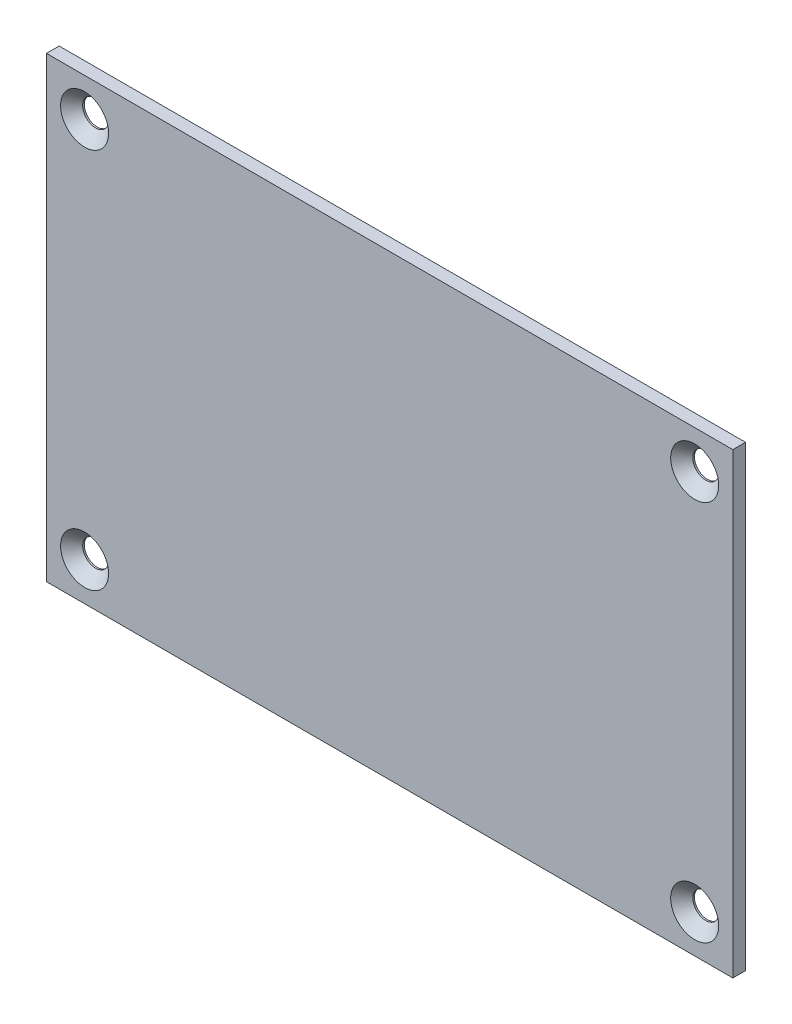
ISO-10303-21;
HEADER;
FILE_DESCRIPTION(('STEP AP214'),'2;1');
FILE_NAME('part.step','',(''),(''),'','','');
FILE_SCHEMA(('AUTOMOTIVE_DESIGN { 1 0 10303 214 1 1 1 1 }'));
ENDSEC;
DATA;
#1=APPLICATION_CONTEXT('core data for automotive mechanical design processes');
#2=APPLICATION_PROTOCOL_DEFINITION('international standard','automotive_design',2000,#1);
#3=PRODUCT_CONTEXT('',#1,'mechanical');
#4=PRODUCT('Part','Part','',(#3));
#5=PRODUCT_RELATED_PRODUCT_CATEGORY('part','',(#4));
#6=PRODUCT_DEFINITION_FORMATION('','',#4);
#7=PRODUCT_DEFINITION_CONTEXT('part definition',#1,'design');
#8=PRODUCT_DEFINITION('design','',#6,#7);
#9=PRODUCT_DEFINITION_SHAPE('','',#8);
#10=(LENGTH_UNIT() NAMED_UNIT(*) SI_UNIT(.MILLI.,.METRE.));
#11=(NAMED_UNIT(*) PLANE_ANGLE_UNIT() SI_UNIT($,.RADIAN.));
#12=(NAMED_UNIT(*) SI_UNIT($,.STERADIAN.) SOLID_ANGLE_UNIT());
#13=UNCERTAINTY_MEASURE_WITH_UNIT(LENGTH_MEASURE(1.E-05),#10,'distance_accuracy_value','');
#14=(GEOMETRIC_REPRESENTATION_CONTEXT(3) GLOBAL_UNCERTAINTY_ASSIGNED_CONTEXT((#13)) GLOBAL_UNIT_ASSIGNED_CONTEXT((#10,
#11,#12)) REPRESENTATION_CONTEXT('',''));
#15=CARTESIAN_POINT('',(0.,0.,0.));
#16=DIRECTION('',(0.,0.,1.));
#17=DIRECTION('',(1.,0.,0.));
#18=AXIS2_PLACEMENT_3D('',#15,#16,#17);
#19=CARTESIAN_POINT('',(0.,0.,1.666));
#20=DIRECTION('',(1.,0.,0.));
#21=DIRECTION('',(0.,0.,-1.));
#22=AXIS2_PLACEMENT_3D('',#19,#20,#21);
#23=PLANE('',#22);
#24=DIRECTION('',(0.,-1.,0.));
#25=VECTOR('',#24,1.);
#26=CARTESIAN_POINT('',(0.,0.,0.));
#27=LINE('',#26,#25);
#28=CARTESIAN_POINT('',(0.,60.,0.));
#29=VERTEX_POINT('',#28);
#30=CARTESIAN_POINT('',(0.,0.,0.));
#31=VERTEX_POINT('',#30);
#32=EDGE_CURVE('E116',#29,#31,#27,.T.);
#33=ORIENTED_EDGE('',*,*,#32,.T.);
#34=DIRECTION('',(0.,0.,-1.));
#35=VECTOR('',#34,1.);
#36=CARTESIAN_POINT('',(0.,0.,1.666));
#37=LINE('',#36,#35);
#38=CARTESIAN_POINT('',(0.,0.,1.666));
#39=VERTEX_POINT('',#38);
#40=EDGE_CURVE('E11',#39,#31,#37,.T.);
#41=ORIENTED_EDGE('',*,*,#40,.F.);
#42=DIRECTION('',(0.,-1.,0.));
#43=VECTOR('',#42,1.);
#44=CARTESIAN_POINT('',(0.,0.,1.666));
#45=LINE('',#44,#43);
#46=CARTESIAN_POINT('',(0.,60.,1.666));
#47=VERTEX_POINT('',#46);
#48=EDGE_CURVE('E99',#47,#39,#45,.T.);
#49=ORIENTED_EDGE('',*,*,#48,.F.);
#50=DIRECTION('',(0.,0.,-1.));
#51=VECTOR('',#50,1.);
#52=CARTESIAN_POINT('',(0.,60.,1.666));
#53=LINE('',#52,#51);
#54=EDGE_CURVE('E112',#47,#29,#53,.T.);
#55=ORIENTED_EDGE('',*,*,#54,.T.);
#56=EDGE_LOOP('',(#33,#41,#49,#55));
#57=FACE_BOUND('',#56,.T.);
#58=ADVANCED_FACE('F45',(#57),#23,.F.);
#59=CARTESIAN_POINT('',(0.,0.,1.666));
#60=DIRECTION('',(0.,1.,0.));
#61=DIRECTION('',(0.,0.,1.));
#62=AXIS2_PLACEMENT_3D('',#59,#60,#61);
#63=PLANE('',#62);
#64=DIRECTION('',(1.,0.,0.));
#65=VECTOR('',#64,1.);
#66=CARTESIAN_POINT('',(0.,0.,0.));
#67=LINE('',#66,#65);
#68=CARTESIAN_POINT('',(90.,0.,0.));
#69=VERTEX_POINT('',#68);
#70=EDGE_CURVE('E104',#31,#69,#67,.T.);
#71=ORIENTED_EDGE('',*,*,#70,.T.);
#72=DIRECTION('',(0.,0.,-1.));
#73=VECTOR('',#72,1.);
#74=CARTESIAN_POINT('',(90.,0.,1.666));
#75=LINE('',#74,#73);
#76=CARTESIAN_POINT('',(90.,0.,1.666));
#77=VERTEX_POINT('',#76);
#78=EDGE_CURVE('E55',#77,#69,#75,.T.);
#79=ORIENTED_EDGE('',*,*,#78,.F.);
#80=DIRECTION('',(1.,0.,0.));
#81=VECTOR('',#80,1.);
#82=CARTESIAN_POINT('',(0.,0.,1.666));
#83=LINE('',#82,#81);
#84=EDGE_CURVE('E94',#39,#77,#83,.T.);
#85=ORIENTED_EDGE('',*,*,#84,.F.);
#86=ORIENTED_EDGE('',*,*,#40,.T.);
#87=EDGE_LOOP('',(#71,#79,#85,#86));
#88=FACE_BOUND('',#87,.T.);
#89=ADVANCED_FACE('F103',(#88),#63,.F.);
#90=CARTESIAN_POINT('',(90.,0.,1.666));
#91=DIRECTION('',(-1.,0.,0.));
#92=DIRECTION('',(0.,0.,1.));
#93=AXIS2_PLACEMENT_3D('',#90,#91,#92);
#94=PLANE('',#93);
#95=DIRECTION('',(0.,1.,0.));
#96=VECTOR('',#95,1.);
#97=CARTESIAN_POINT('',(90.,0.,0.));
#98=LINE('',#97,#96);
#99=CARTESIAN_POINT('',(90.,60.,0.));
#100=VERTEX_POINT('',#99);
#101=EDGE_CURVE('E81',#69,#100,#98,.T.);
#102=ORIENTED_EDGE('',*,*,#101,.T.);
#103=DIRECTION('',(0.,0.,-1.));
#104=VECTOR('',#103,1.);
#105=CARTESIAN_POINT('',(90.,60.,1.666));
#106=LINE('',#105,#104);
#107=CARTESIAN_POINT('',(90.,60.,1.666));
#108=VERTEX_POINT('',#107);
#109=EDGE_CURVE('E106',#108,#100,#106,.T.);
#110=ORIENTED_EDGE('',*,*,#109,.F.);
#111=DIRECTION('',(0.,1.,0.));
#112=VECTOR('',#111,1.);
#113=CARTESIAN_POINT('',(90.,0.,1.666));
#114=LINE('',#113,#112);
#115=EDGE_CURVE('E97',#77,#108,#114,.T.);
#116=ORIENTED_EDGE('',*,*,#115,.F.);
#117=ORIENTED_EDGE('',*,*,#78,.T.);
#118=EDGE_LOOP('',(#102,#110,#116,#117));
#119=FACE_BOUND('',#118,.T.);
#120=ADVANCED_FACE('F108',(#119),#94,.F.);
#121=CARTESIAN_POINT('',(0.,60.,1.666));
#122=DIRECTION('',(0.,-1.,0.));
#123=DIRECTION('',(0.,0.,-1.));
#124=AXIS2_PLACEMENT_3D('',#121,#122,#123);
#125=PLANE('',#124);
#126=DIRECTION('',(-1.,0.,0.));
#127=VECTOR('',#126,1.);
#128=CARTESIAN_POINT('',(0.,60.,0.));
#129=LINE('',#128,#127);
#130=EDGE_CURVE('E87',#100,#29,#129,.T.);
#131=ORIENTED_EDGE('',*,*,#130,.T.);
#132=ORIENTED_EDGE('',*,*,#54,.F.);
#133=DIRECTION('',(-1.,0.,0.));
#134=VECTOR('',#133,1.);
#135=CARTESIAN_POINT('',(0.,60.,1.666));
#136=LINE('',#135,#134);
#137=EDGE_CURVE('E64',#108,#47,#136,.T.);
#138=ORIENTED_EDGE('',*,*,#137,.F.);
#139=ORIENTED_EDGE('',*,*,#109,.T.);
#140=EDGE_LOOP('',(#131,#132,#138,#139));
#141=FACE_BOUND('',#140,.T.);
#142=ADVANCED_FACE('F183',(#141),#125,.F.);
#143=CARTESIAN_POINT('',(0.,0.,1.666));
#144=DIRECTION('',(0.,0.,-1.));
#145=DIRECTION('',(-1.,0.,0.));
#146=AXIS2_PLACEMENT_3D('',#143,#144,#145);
#147=PLANE('',#146);
#148=CARTESIAN_POINT('',(5.,55.,1.666));
#149=DIRECTION('',(0.,0.,1.));
#150=DIRECTION('',(1.,0.,0.));
#151=AXIS2_PLACEMENT_3D('',#148,#149,#150);
#152=CIRCLE('',#151,3.15);
#153=CARTESIAN_POINT('',(8.15,55.,1.666));
#154=VERTEX_POINT('',#153);
#155=EDGE_CURVE('E305',#154,#154,#152,.T.);
#156=ORIENTED_EDGE('',*,*,#155,.F.);
#157=EDGE_LOOP('',(#156));
#158=FACE_BOUND('',#157,.T.);
#159=CARTESIAN_POINT('',(5.,5.,1.666));
#160=DIRECTION('',(0.,0.,1.));
#161=DIRECTION('',(1.,0.,0.));
#162=AXIS2_PLACEMENT_3D('',#159,#160,#161);
#163=CIRCLE('',#162,3.15);
#164=CARTESIAN_POINT('',(8.15,5.,1.666));
#165=VERTEX_POINT('',#164);
#166=EDGE_CURVE('E152',#165,#165,#163,.T.);
#167=ORIENTED_EDGE('',*,*,#166,.F.);
#168=EDGE_LOOP('',(#167));
#169=FACE_BOUND('',#168,.T.);
#170=CARTESIAN_POINT('',(85.,5.,1.666));
#171=DIRECTION('',(0.,0.,1.));
#172=DIRECTION('',(1.,0.,0.));
#173=AXIS2_PLACEMENT_3D('',#170,#171,#172);
#174=CIRCLE('',#173,3.15);
#175=CARTESIAN_POINT('',(88.15,5.,1.666));
#176=VERTEX_POINT('',#175);
#177=EDGE_CURVE('E143',#176,#176,#174,.T.);
#178=ORIENTED_EDGE('',*,*,#177,.F.);
#179=EDGE_LOOP('',(#178));
#180=FACE_BOUND('',#179,.T.);
#181=CARTESIAN_POINT('',(85.,55.,1.666));
#182=DIRECTION('',(0.,0.,1.));
#183=DIRECTION('',(1.,0.,0.));
#184=AXIS2_PLACEMENT_3D('',#181,#182,#183);
#185=CIRCLE('',#184,3.15);
#186=CARTESIAN_POINT('',(88.15,55.,1.666));
#187=VERTEX_POINT('',#186);
#188=EDGE_CURVE('E138',#187,#187,#185,.T.);
#189=ORIENTED_EDGE('',*,*,#188,.F.);
#190=EDGE_LOOP('',(#189));
#191=FACE_BOUND('',#190,.T.);
#192=ORIENTED_EDGE('',*,*,#48,.T.);
#193=ORIENTED_EDGE('',*,*,#84,.T.);
#194=ORIENTED_EDGE('',*,*,#115,.T.);
#195=ORIENTED_EDGE('',*,*,#137,.T.);
#196=EDGE_LOOP('',(#192,#193,#194,#195));
#197=FACE_BOUND('',#196,.T.);
#198=ADVANCED_FACE('F95',(#158,#169,#180,#191,#197),#147,.F.);
#199=CARTESIAN_POINT('',(0.,0.,0.));
#200=DIRECTION('',(0.,0.,-1.));
#201=DIRECTION('',(-1.,0.,0.));
#202=AXIS2_PLACEMENT_3D('',#199,#200,#201);
#203=PLANE('',#202);
#204=CARTESIAN_POINT('',(5.,55.,0.));
#205=DIRECTION('',(0.,0.,-1.));
#206=DIRECTION('',(-1.,0.,0.));
#207=AXIS2_PLACEMENT_3D('',#204,#205,#206);
#208=CIRCLE('',#207,1.69999999999999);
#209=CARTESIAN_POINT('',(3.30000000000001,55.,0.));
#210=VERTEX_POINT('',#209);
#211=EDGE_CURVE('E48',#210,#210,#208,.T.);
#212=ORIENTED_EDGE('',*,*,#211,.F.);
#213=EDGE_LOOP('',(#212));
#214=FACE_BOUND('',#213,.T.);
#215=CARTESIAN_POINT('',(5.,5.,0.));
#216=DIRECTION('',(0.,0.,-1.));
#217=DIRECTION('',(-1.,0.,0.));
#218=AXIS2_PLACEMENT_3D('',#215,#216,#217);
#219=CIRCLE('',#218,1.69999999999999);
#220=CARTESIAN_POINT('',(3.30000000000001,5.,0.));
#221=VERTEX_POINT('',#220);
#222=EDGE_CURVE('E140',#221,#221,#219,.T.);
#223=ORIENTED_EDGE('',*,*,#222,.F.);
#224=EDGE_LOOP('',(#223));
#225=FACE_BOUND('',#224,.T.);
#226=CARTESIAN_POINT('',(85.,5.,0.));
#227=DIRECTION('',(0.,0.,-1.));
#228=DIRECTION('',(-1.,0.,0.));
#229=AXIS2_PLACEMENT_3D('',#226,#227,#228);
#230=CIRCLE('',#229,1.69999999999999);
#231=CARTESIAN_POINT('',(83.3,5.,0.));
#232=VERTEX_POINT('',#231);
#233=EDGE_CURVE('E135',#232,#232,#230,.T.);
#234=ORIENTED_EDGE('',*,*,#233,.F.);
#235=EDGE_LOOP('',(#234));
#236=FACE_BOUND('',#235,.T.);
#237=CARTESIAN_POINT('',(85.,55.,0.));
#238=DIRECTION('',(0.,0.,-1.));
#239=DIRECTION('',(-1.,0.,0.));
#240=AXIS2_PLACEMENT_3D('',#237,#238,#239);
#241=CIRCLE('',#240,1.69999999999999);
#242=CARTESIAN_POINT('',(83.3,55.,0.));
#243=VERTEX_POINT('',#242);
#244=EDGE_CURVE('E120',#243,#243,#241,.T.);
#245=ORIENTED_EDGE('',*,*,#244,.F.);
#246=EDGE_LOOP('',(#245));
#247=FACE_BOUND('',#246,.T.);
#248=ORIENTED_EDGE('',*,*,#32,.F.);
#249=ORIENTED_EDGE('',*,*,#130,.F.);
#250=ORIENTED_EDGE('',*,*,#101,.F.);
#251=ORIENTED_EDGE('',*,*,#70,.F.);
#252=EDGE_LOOP('',(#248,#249,#250,#251));
#253=FACE_BOUND('',#252,.T.);
#254=ADVANCED_FACE('F182',(#214,#225,#236,#247,#253),#203,.T.);
#255=CARTESIAN_POINT('',(85.,55.,1.666));
#256=DIRECTION('',(0.,0.,1.));
#257=DIRECTION('',(1.,0.,0.));
#258=AXIS2_PLACEMENT_3D('',#255,#256,#257);
#259=CYLINDRICAL_SURFACE('',#258,1.69999999999999);
#260=ORIENTED_EDGE('',*,*,#244,.T.);
#261=EDGE_LOOP('',(#260));
#262=FACE_BOUND('',#261,.T.);
#263=CARTESIAN_POINT('',(85.,55.,0.215999999999993));
#264=DIRECTION('',(0.,0.,1.));
#265=DIRECTION('',(1.,0.,0.));
#266=AXIS2_PLACEMENT_3D('',#263,#264,#265);
#267=CIRCLE('',#266,1.69999999999999);
#268=CARTESIAN_POINT('',(86.7,55.,0.215999999999993));
#269=VERTEX_POINT('',#268);
#270=EDGE_CURVE('E134',#269,#269,#267,.T.);
#271=ORIENTED_EDGE('',*,*,#270,.T.);
#272=EDGE_LOOP('',(#271));
#273=FACE_BOUND('',#272,.T.);
#274=ADVANCED_FACE('F172',(#262,#273),#259,.F.);
#275=CARTESIAN_POINT('',(85.,55.,1.666));
#276=DIRECTION('',(0.,0.,1.));
#277=DIRECTION('',(1.,0.,0.));
#278=AXIS2_PLACEMENT_3D('',#275,#276,#277);
#279=CONICAL_SURFACE('',#278,3.15,0.785398163397448);
#280=ORIENTED_EDGE('',*,*,#270,.F.);
#281=EDGE_LOOP('',(#280));
#282=FACE_BOUND('',#281,.T.);
#283=ORIENTED_EDGE('',*,*,#188,.T.);
#284=EDGE_LOOP('',(#283));
#285=FACE_BOUND('',#284,.T.);
#286=ADVANCED_FACE('F174',(#282,#285),#279,.F.);
#287=CARTESIAN_POINT('',(85.,5.,1.666));
#288=DIRECTION('',(0.,0.,1.));
#289=DIRECTION('',(1.,0.,0.));
#290=AXIS2_PLACEMENT_3D('',#287,#288,#289);
#291=CYLINDRICAL_SURFACE('',#290,1.69999999999999);
#292=ORIENTED_EDGE('',*,*,#233,.T.);
#293=EDGE_LOOP('',(#292));
#294=FACE_BOUND('',#293,.T.);
#295=CARTESIAN_POINT('',(85.,5.,0.215999999999993));
#296=DIRECTION('',(0.,0.,1.));
#297=DIRECTION('',(1.,0.,0.));
#298=AXIS2_PLACEMENT_3D('',#295,#296,#297);
#299=CIRCLE('',#298,1.69999999999999);
#300=CARTESIAN_POINT('',(86.7,5.,0.215999999999993));
#301=VERTEX_POINT('',#300);
#302=EDGE_CURVE('E139',#301,#301,#299,.T.);
#303=ORIENTED_EDGE('',*,*,#302,.T.);
#304=EDGE_LOOP('',(#303));
#305=FACE_BOUND('',#304,.T.);
#306=ADVANCED_FACE('F177',(#294,#305),#291,.F.);
#307=CARTESIAN_POINT('',(85.,5.,1.666));
#308=DIRECTION('',(0.,0.,1.));
#309=DIRECTION('',(1.,0.,0.));
#310=AXIS2_PLACEMENT_3D('',#307,#308,#309);
#311=CONICAL_SURFACE('',#310,3.15,0.785398163397448);
#312=ORIENTED_EDGE('',*,*,#302,.F.);
#313=EDGE_LOOP('',(#312));
#314=FACE_BOUND('',#313,.T.);
#315=ORIENTED_EDGE('',*,*,#177,.T.);
#316=EDGE_LOOP('',(#315));
#317=FACE_BOUND('',#316,.T.);
#318=ADVANCED_FACE('F248',(#314,#317),#311,.F.);
#319=CARTESIAN_POINT('',(5.,5.,1.666));
#320=DIRECTION('',(0.,0.,1.));
#321=DIRECTION('',(1.,0.,0.));
#322=AXIS2_PLACEMENT_3D('',#319,#320,#321);
#323=CYLINDRICAL_SURFACE('',#322,1.69999999999999);
#324=ORIENTED_EDGE('',*,*,#222,.T.);
#325=EDGE_LOOP('',(#324));
#326=FACE_BOUND('',#325,.T.);
#327=CARTESIAN_POINT('',(5.,5.,0.215999999999993));
#328=DIRECTION('',(0.,0.,1.));
#329=DIRECTION('',(1.,0.,0.));
#330=AXIS2_PLACEMENT_3D('',#327,#328,#329);
#331=CIRCLE('',#330,1.69999999999999);
#332=CARTESIAN_POINT('',(6.69999999999999,5.,0.215999999999993));
#333=VERTEX_POINT('',#332);
#334=EDGE_CURVE('E144',#333,#333,#331,.T.);
#335=ORIENTED_EDGE('',*,*,#334,.T.);
#336=EDGE_LOOP('',(#335));
#337=FACE_BOUND('',#336,.T.);
#338=ADVANCED_FACE('F258',(#326,#337),#323,.F.);
#339=CARTESIAN_POINT('',(5.,5.,1.666));
#340=DIRECTION('',(0.,0.,1.));
#341=DIRECTION('',(1.,0.,0.));
#342=AXIS2_PLACEMENT_3D('',#339,#340,#341);
#343=CONICAL_SURFACE('',#342,3.15,0.78539816339745);
#344=ORIENTED_EDGE('',*,*,#334,.F.);
#345=EDGE_LOOP('',(#344));
#346=FACE_BOUND('',#345,.T.);
#347=ORIENTED_EDGE('',*,*,#166,.T.);
#348=EDGE_LOOP('',(#347));
#349=FACE_BOUND('',#348,.T.);
#350=ADVANCED_FACE('F268',(#346,#349),#343,.F.);
#351=CARTESIAN_POINT('',(5.,55.,1.666));
#352=DIRECTION('',(0.,0.,1.));
#353=DIRECTION('',(1.,0.,0.));
#354=AXIS2_PLACEMENT_3D('',#351,#352,#353);
#355=CYLINDRICAL_SURFACE('',#354,1.69999999999999);
#356=ORIENTED_EDGE('',*,*,#211,.T.);
#357=EDGE_LOOP('',(#356));
#358=FACE_BOUND('',#357,.T.);
#359=CARTESIAN_POINT('',(5.,55.,0.215999999999993));
#360=DIRECTION('',(0.,0.,1.));
#361=DIRECTION('',(1.,0.,0.));
#362=AXIS2_PLACEMENT_3D('',#359,#360,#361);
#363=CIRCLE('',#362,1.69999999999999);
#364=CARTESIAN_POINT('',(6.69999999999999,55.,0.215999999999993));
#365=VERTEX_POINT('',#364);
#366=EDGE_CURVE('E303',#365,#365,#363,.T.);
#367=ORIENTED_EDGE('',*,*,#366,.T.);
#368=EDGE_LOOP('',(#367));
#369=FACE_BOUND('',#368,.T.);
#370=ADVANCED_FACE('F277',(#358,#369),#355,.F.);
#371=CARTESIAN_POINT('',(5.,55.,1.666));
#372=DIRECTION('',(0.,0.,1.));
#373=DIRECTION('',(1.,0.,0.));
#374=AXIS2_PLACEMENT_3D('',#371,#372,#373);
#375=CONICAL_SURFACE('',#374,3.15,0.78539816339745);
#376=ORIENTED_EDGE('',*,*,#366,.F.);
#377=EDGE_LOOP('',(#376));
#378=FACE_BOUND('',#377,.T.);
#379=ORIENTED_EDGE('',*,*,#155,.T.);
#380=EDGE_LOOP('',(#379));
#381=FACE_BOUND('',#380,.T.);
#382=ADVANCED_FACE('F287',(#378,#381),#375,.F.);
#383=CLOSED_SHELL('',(#58,#89,#120,#142,#198,#254,#274,#286,#306,#318,#338,#350,#370,#382));
#384=MANIFOLD_SOLID_BREP('B2',#383);
#385=ADVANCED_BREP_SHAPE_REPRESENTATION('',(#18,#384),#14);
#386=SHAPE_DEFINITION_REPRESENTATION(#9,#385);
ENDSEC;
END-ISO-10303-21;
